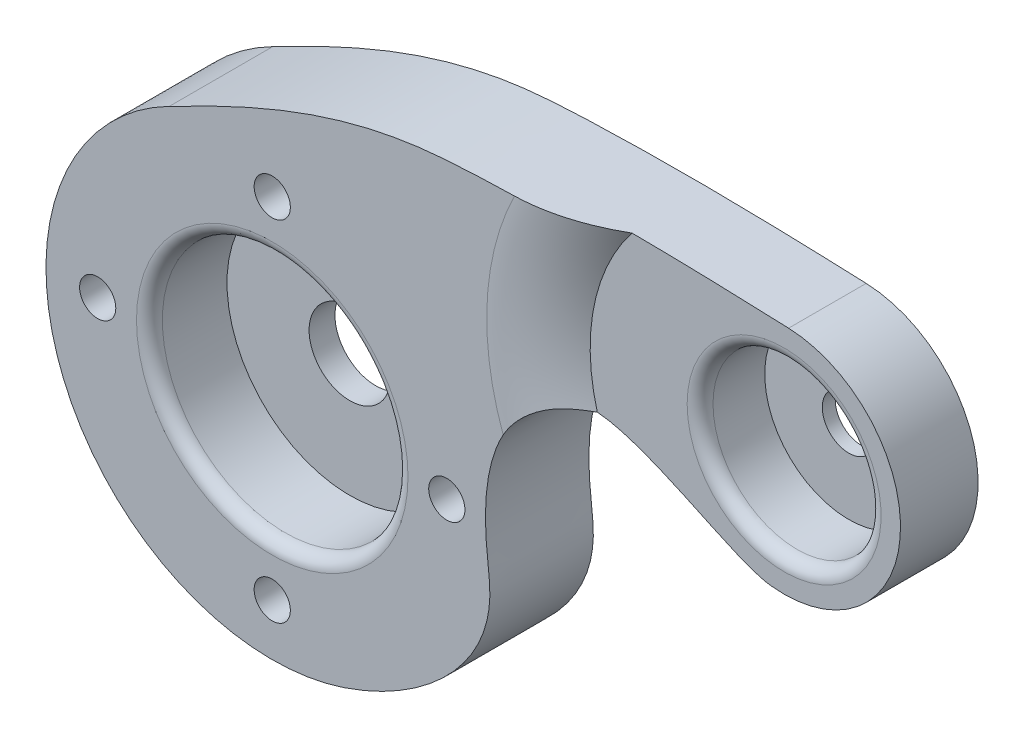
ISO-10303-21;
HEADER;
FILE_DESCRIPTION(('STEP AP214'),'2;1');
FILE_NAME('part.step','',(''),(''),'','','');
FILE_SCHEMA(('AUTOMOTIVE_DESIGN { 1 0 10303 214 1 1 1 1 }'));
ENDSEC;
DATA;
#1=APPLICATION_CONTEXT('core data for automotive mechanical design processes');
#2=APPLICATION_PROTOCOL_DEFINITION('international standard','automotive_design',2000,#1);
#3=PRODUCT_CONTEXT('',#1,'mechanical');
#4=PRODUCT('Part','Part','',(#3));
#5=PRODUCT_RELATED_PRODUCT_CATEGORY('part','',(#4));
#6=PRODUCT_DEFINITION_FORMATION('','',#4);
#7=PRODUCT_DEFINITION_CONTEXT('part definition',#1,'design');
#8=PRODUCT_DEFINITION('design','',#6,#7);
#9=PRODUCT_DEFINITION_SHAPE('','',#8);
#10=(LENGTH_UNIT() NAMED_UNIT(*) SI_UNIT(.MILLI.,.METRE.));
#11=(NAMED_UNIT(*) PLANE_ANGLE_UNIT() SI_UNIT($,.RADIAN.));
#12=(NAMED_UNIT(*) SI_UNIT($,.STERADIAN.) SOLID_ANGLE_UNIT());
#13=UNCERTAINTY_MEASURE_WITH_UNIT(LENGTH_MEASURE(1.E-05),#10,'distance_accuracy_value','');
#14=(GEOMETRIC_REPRESENTATION_CONTEXT(3) GLOBAL_UNCERTAINTY_ASSIGNED_CONTEXT((#13)) GLOBAL_UNIT_ASSIGNED_CONTEXT((#10,
#11,#12)) REPRESENTATION_CONTEXT('',''));
#15=CARTESIAN_POINT('',(0.,0.,0.));
#16=DIRECTION('',(0.,0.,1.));
#17=DIRECTION('',(1.,0.,0.));
#18=AXIS2_PLACEMENT_3D('',#15,#16,#17);
#19=CARTESIAN_POINT('',(37.5877048314363,13.6808057330268,8.));
#20=DIRECTION('',(0.,0.,-1.));
#21=DIRECTION('',(-1.,0.,0.));
#22=AXIS2_PLACEMENT_3D('',#19,#20,#21);
#23=CYLINDRICAL_SURFACE('',#22,2.04999999999999);
#24=CARTESIAN_POINT('',(37.5877048314363,13.6808057330268,0.));
#25=DIRECTION('',(0.,0.,1.));
#26=DIRECTION('',(1.,0.,0.));
#27=AXIS2_PLACEMENT_3D('',#24,#25,#26);
#28=CIRCLE('',#27,2.04999999999999);
#29=CARTESIAN_POINT('',(39.6377048314363,13.6808057330268,0.));
#30=VERTEX_POINT('',#29);
#31=EDGE_CURVE('E161',#30,#30,#28,.T.);
#32=ORIENTED_EDGE('',*,*,#31,.F.);
#33=EDGE_LOOP('',(#32));
#34=FACE_BOUND('',#33,.T.);
#35=CARTESIAN_POINT('',(37.5877048314363,13.6808057330268,1.));
#36=DIRECTION('',(0.,0.,1.));
#37=DIRECTION('',(1.,0.,0.));
#38=AXIS2_PLACEMENT_3D('',#35,#36,#37);
#39=CIRCLE('',#38,2.04999999999999);
#40=CARTESIAN_POINT('',(39.6377048314363,13.6808057330268,1.));
#41=VERTEX_POINT('',#40);
#42=EDGE_CURVE('E304',#41,#41,#39,.T.);
#43=ORIENTED_EDGE('',*,*,#42,.T.);
#44=EDGE_LOOP('',(#43));
#45=FACE_BOUND('',#44,.T.);
#46=ADVANCED_FACE('F35',(#34,#45),#23,.F.);
#47=CARTESIAN_POINT('',(0.,0.,8.));
#48=DIRECTION('',(0.,0.,-1.));
#49=DIRECTION('',(-1.,0.,0.));
#50=AXIS2_PLACEMENT_3D('',#47,#48,#49);
#51=CYLINDRICAL_SURFACE('',#50,3.15);
#52=CARTESIAN_POINT('',(0.,0.,0.));
#53=DIRECTION('',(0.,0.,1.));
#54=DIRECTION('',(1.,0.,0.));
#55=AXIS2_PLACEMENT_3D('',#52,#53,#54);
#56=CIRCLE('',#55,3.15);
#57=CARTESIAN_POINT('',(3.15,0.,0.));
#58=VERTEX_POINT('',#57);
#59=EDGE_CURVE('E228',#58,#58,#56,.T.);
#60=ORIENTED_EDGE('',*,*,#59,.F.);
#61=EDGE_LOOP('',(#60));
#62=FACE_BOUND('',#61,.T.);
#63=CARTESIAN_POINT('',(0.,0.,2.));
#64=DIRECTION('',(0.,0.,1.));
#65=DIRECTION('',(1.,0.,0.));
#66=AXIS2_PLACEMENT_3D('',#63,#64,#65);
#67=CIRCLE('',#66,3.15);
#68=CARTESIAN_POINT('',(3.15,0.,2.));
#69=VERTEX_POINT('',#68);
#70=EDGE_CURVE('E110',#69,#69,#67,.T.);
#71=ORIENTED_EDGE('',*,*,#70,.T.);
#72=EDGE_LOOP('',(#71));
#73=FACE_BOUND('',#72,.T.);
#74=ADVANCED_FACE('F273',(#62,#73),#51,.F.);
#75=CARTESIAN_POINT('',(0.,0.,8.));
#76=DIRECTION('',(0.,0.,-1.));
#77=DIRECTION('',(-1.,0.,0.));
#78=AXIS2_PLACEMENT_3D('',#75,#76,#77);
#79=CYLINDRICAL_SURFACE('',#78,17.5);
#80=CARTESIAN_POINT('',(0.,0.,0.));
#81=DIRECTION('',(0.,0.,1.));
#82=DIRECTION('',(1.,0.,0.));
#83=AXIS2_PLACEMENT_3D('',#80,#81,#82);
#84=CIRCLE('',#83,17.5);
#85=CARTESIAN_POINT('',(-7.96176737995493,15.58397446698,0.));
#86=VERTEX_POINT('',#85);
#87=CARTESIAN_POINT('',(5.55768387836295,-16.5940395898101,0.));
#88=VERTEX_POINT('',#87);
#89=EDGE_CURVE('E204',#86,#88,#84,.T.);
#90=ORIENTED_EDGE('',*,*,#89,.T.);
#91=DIRECTION('',(0.,0.,-1.));
#92=VECTOR('',#91,1.);
#93=CARTESIAN_POINT('',(5.55768387836295,-16.5940395898101,8.));
#94=LINE('',#93,#92);
#95=CARTESIAN_POINT('',(5.55768387836295,-16.5940395898101,8.));
#96=VERTEX_POINT('',#95);
#97=EDGE_CURVE('E186',#96,#88,#94,.T.);
#98=ORIENTED_EDGE('',*,*,#97,.F.);
#99=CARTESIAN_POINT('',(0.,0.,8.));
#100=DIRECTION('',(0.,0.,1.));
#101=DIRECTION('',(1.,0.,0.));
#102=AXIS2_PLACEMENT_3D('',#99,#100,#101);
#103=CIRCLE('',#102,17.5);
#104=CARTESIAN_POINT('',(-7.96176737995493,15.58397446698,8.));
#105=VERTEX_POINT('',#104);
#106=EDGE_CURVE('E157',#105,#96,#103,.T.);
#107=ORIENTED_EDGE('',*,*,#106,.F.);
#108=DIRECTION('',(0.,0.,-1.));
#109=VECTOR('',#108,1.);
#110=CARTESIAN_POINT('',(-7.96176737995493,15.58397446698,8.));
#111=LINE('',#110,#109);
#112=EDGE_CURVE('E235',#105,#86,#111,.T.);
#113=ORIENTED_EDGE('',*,*,#112,.T.);
#114=EDGE_LOOP('',(#90,#98,#107,#113));
#115=FACE_BOUND('',#114,.T.);
#116=ADVANCED_FACE('F245',(#115),#79,.T.);
#117=CARTESIAN_POINT('',(5.55768387836296,-16.5940395898101,8.));
#118=CARTESIAN_POINT('',(11.479074634782,-14.6108444933824,8.));
#119=CARTESIAN_POINT('',(17.7514051432126,-9.23424516396689,8.));
#120=CARTESIAN_POINT('',(16.1157576191301,0.631694435639719,8.));
#121=CARTESIAN_POINT('',(16.8258100093931,7.05228605404796,8.));
#122=CARTESIAN_POINT('',(24.2741784094079,11.5056013909045,8.));
#123=CARTESIAN_POINT('',(33.3007065582728,5.11380794582418,8.));
#124=CARTESIAN_POINT('',(36.5613375805055,4.73952113481514,8.));
#125=B_SPLINE_CURVE_WITH_KNOTS('',3,(#117,#118,#119,#120,#121,#122,#123,#124),.UNSPECIFIED.,.F.,
.F.,(4,1,1,1,1,4),(0.,0.382951964631993,0.45496999005837,0.690712447129833,0.748162228837389,
1.),.UNSPECIFIED.);
#126=DIRECTION('',(0.,0.,-1.));
#127=VECTOR('',#126,1.);
#128=SURFACE_OF_LINEAR_EXTRUSION('',#125,#127);
#129=CARTESIAN_POINT('',(23.1382459260945,9.65425170472237,6.));
#130=CARTESIAN_POINT('',(23.2640152070081,9.64419759604737,6.));
#131=CARTESIAN_POINT('',(23.3894895816123,9.63095530208401,6.));
#132=CARTESIAN_POINT('',(23.6393187707081,9.59895935829436,6.));
#133=CARTESIAN_POINT('',(23.7636759130966,9.58022403562799,6.));
#134=CARTESIAN_POINT('',(24.0113725867275,9.53806394873069,6.));
#135=CARTESIAN_POINT('',(24.1347134347386,9.51464678892156,6.));
#136=CARTESIAN_POINT('',(24.3804743815391,9.46375185238557,6.));
#137=CARTESIAN_POINT('',(24.5028949759453,9.43627645486302,6.));
#138=CARTESIAN_POINT('',(24.7468840804066,9.37779333873347,6.));
#139=CARTESIAN_POINT('',(24.8684525921673,9.34678562719945,6.));
#140=CARTESIAN_POINT('',(25.1104430429565,9.28177303349309,6.));
#141=CARTESIAN_POINT('',(25.2308671418245,9.24777615697567,6.));
#142=CARTESIAN_POINT('',(25.4709865467708,9.17707705632932,6.));
#143=CARTESIAN_POINT('',(25.5906814241183,9.14037338101798,6.));
#144=CARTESIAN_POINT('',(25.8293728435823,9.06458397882042,6.));
#145=CARTESIAN_POINT('',(25.9483690409156,9.02549716912471,6.));
#146=CARTESIAN_POINT('',(26.1856814027588,8.94522775323157,6.));
#147=CARTESIAN_POINT('',(26.3039974051384,8.90404466868637,6.));
#148=CARTESIAN_POINT('',(26.5399560930011,8.81983735309761,6.));
#149=CARTESIAN_POINT('',(26.6575988498692,8.7768133215123,6.));
#150=CARTESIAN_POINT('',(27.0491666860144,8.6305252254352,6.));
#151=CARTESIAN_POINT('',(27.3217384425215,8.52363151589613,6.));
#152=CARTESIAN_POINT('',(27.8640781805346,8.30324580659157,6.));
#153=CARTESIAN_POINT('',(28.1338469773217,8.18975579260304,6.));
#154=CARTESIAN_POINT('',(28.6713122334807,7.95788055544542,6.));
#155=CARTESIAN_POINT('',(28.9390083746226,7.83949459759205,6.));
#156=CARTESIAN_POINT('',(29.4729367217552,7.59930081776597,6.));
#157=CARTESIAN_POINT('',(29.7391685304912,7.4774921171818,6.));
#158=CARTESIAN_POINT('',(30.2707274201056,7.23181073359647,6.));
#159=CARTESIAN_POINT('',(30.5360543445288,7.10793771350316,6.));
#160=CARTESIAN_POINT('',(31.0663604028722,6.85948424497285,6.));
#161=CARTESIAN_POINT('',(31.3313395524361,6.73490382979949,6.));
#162=CARTESIAN_POINT('',(31.8636413985895,6.48554076091835,6.));
#163=CARTESIAN_POINT('',(32.1309667025719,6.36076366336839,6.));
#164=CARTESIAN_POINT('',(32.6667301791345,6.11374498027342,6.));
#165=CARTESIAN_POINT('',(32.9351681079728,5.99150287132084,6.));
#166=CARTESIAN_POINT('',(33.3394377454827,5.81186672828693,6.));
#167=CARTESIAN_POINT('',(33.4744431251265,5.75261761674402,6.));
#168=CARTESIAN_POINT('',(33.7451617893349,5.63577780997365,6.));
#169=CARTESIAN_POINT('',(33.8808750289158,5.57818701084321,6.));
#170=CARTESIAN_POINT('',(34.1531935334519,5.4651801852718,6.));
#171=CARTESIAN_POINT('',(34.2897987204491,5.40976397165864,6.));
#172=CARTESIAN_POINT('',(34.5641723361399,5.30177234603853,6.));
#173=CARTESIAN_POINT('',(34.7019410365612,5.24919762010858,6.));
#174=CARTESIAN_POINT('',(34.9792088653701,5.14772755443842,6.));
#175=CARTESIAN_POINT('',(35.1187113480634,5.09884132904292,6.));
#176=CARTESIAN_POINT('',(35.3993628021552,5.00627397813085,6.));
#177=CARTESIAN_POINT('',(35.5405106113704,4.96258939719899,6.));
#178=CARTESIAN_POINT('',(35.7546722455652,4.90229300506396,6.));
#179=CARTESIAN_POINT('',(35.826919809411,4.88296318830775,6.));
#180=CARTESIAN_POINT('',(35.9719756892752,4.84659111114364,6.));
#181=CARTESIAN_POINT('',(36.0447838793624,4.82954835199096,6.));
#182=CARTESIAN_POINT('',(36.1911746847854,4.79820868878696,6.));
#183=CARTESIAN_POINT('',(36.2647586835575,4.78391810987329,6.));
#184=CARTESIAN_POINT('',(36.4125776331145,4.75887291074931,6.));
#185=CARTESIAN_POINT('',(36.4868130366664,4.74812098972282,6.));
#186=CARTESIAN_POINT('',(36.5613380428642,4.73952108174113,6.));
#187=B_SPLINE_CURVE_WITH_KNOTS('',3,(#129,#130,#131,#132,#133,#134,#135,#136,#137,#138,#139,
#140,#141,#142,#143,#144,#145,#146,#147,#148,#149,#150,#151,#152,#153,#154,#155,#156,#157,#158,
#159,#160,#161,#162,#163,#164,#165,#166,#167,#168,#169,#170,#171,#172,#173,#174,#175,#176,#177,
#178,#179,#180,#181,#182,#183,#184,#185,#186),.UNSPECIFIED.,.F.,.F.,(4,2,2,2,2,2,2,2,2,2,2,2,2,
2,2,2,2,2,2,2,2,2,2,2,2,2,2,2,4),(0.,0.378413101132713,0.755577744736163,1.13213468817418,
1.5084717391717,1.88480803661887,2.26016545467898,2.63572559502935,3.01145766660122,
3.3872758640207,3.76305344584003,4.64126522098083,5.51921397160913,6.39729494850156,
7.27560342416746,8.15405675619288,9.03246911749472,9.91750389077045,10.8023540709862,
11.2446491933296,11.6869165427271,12.1291457411599,12.5714812431124,13.0148762111495,
13.4579749721292,13.6823116085252,13.9065992434526,14.1313963471106,14.356364524098),.UNSPECIFIED.);
#188=CARTESIAN_POINT('',(23.1382459260945,9.65425170472237,6.));
#189=VERTEX_POINT('',#188);
#190=CARTESIAN_POINT('',(36.5613380428642,4.73952108174113,6.));
#191=VERTEX_POINT('',#190);
#192=EDGE_CURVE('E306',#189,#191,#187,.T.);
#193=ORIENTED_EDGE('',*,*,#192,.F.);
#194=CARTESIAN_POINT('',(23.1382459260945,9.65425170472237,6.));
#195=CARTESIAN_POINT('',(23.0518277695852,9.66112789087465,6.06105006803642));
#196=CARTESIAN_POINT('',(22.9645764911161,9.66655623771168,6.12111975200413));
#197=CARTESIAN_POINT('',(22.7882292760397,9.67394943682212,6.23938713922192));
#198=CARTESIAN_POINT('',(22.6991279454182,9.6759020818045,6.297577542531));
#199=CARTESIAN_POINT('',(22.5194064205331,9.67571954302052,6.41181122302604));
#200=CARTESIAN_POINT('',(22.4287845950047,9.67357964816753,6.46785194987898));
#201=CARTESIAN_POINT('',(22.2461518958988,9.66448810907557,6.57767815753795));
#202=CARTESIAN_POINT('',(22.1541385162113,9.65752642311856,6.63145868293434));
#203=CARTESIAN_POINT('',(21.9693356577708,9.63799593586545,6.73639893083966));
#204=CARTESIAN_POINT('',(21.8765471661252,9.62543343732079,6.78756152743279));
#205=CARTESIAN_POINT('',(21.6906287523463,9.593822503808,6.88707911331834));
#206=CARTESIAN_POINT('',(21.5974990850504,9.5747782011716,6.93543586847965));
#207=CARTESIAN_POINT('',(21.4281377014056,9.53402789892378,7.0206656292895));
#208=CARTESIAN_POINT('',(21.3518896430106,9.51342254723845,7.05803613718981));
#209=CARTESIAN_POINT('',(21.1997037955578,9.46765483920724,7.13064347266055));
#210=CARTESIAN_POINT('',(21.1237661341161,9.44249077017725,7.16587949165405));
#211=CARTESIAN_POINT('',(20.9725174946444,9.38763069671921,7.23410643985465));
#212=CARTESIAN_POINT('',(20.89720654471,9.35793449025728,7.2670972688807));
#213=CARTESIAN_POINT('',(20.7477519602328,9.29421305606305,7.33065392053918));
#214=CARTESIAN_POINT('',(20.6736051958707,9.26020310970301,7.36122771327577));
#215=CARTESIAN_POINT('',(20.5264735299064,9.18793141709829,7.42003567326294));
#216=CARTESIAN_POINT('',(20.4534885430494,9.14966998450027,7.44827001283504));
#217=CARTESIAN_POINT('',(20.3089070708839,9.06911089874885,7.50238894900551));
#218=CARTESIAN_POINT('',(20.2373104340314,9.02681368913505,7.52827380320808));
#219=CARTESIAN_POINT('',(20.0608987350977,8.91672314187641,7.58985587867545));
#220=CARTESIAN_POINT('',(19.9570296128396,8.84660635534186,7.62413247805494));
#221=CARTESIAN_POINT('',(19.7531609194658,8.69887566812984,7.68766723402595));
#222=CARTESIAN_POINT('',(19.6531619176324,8.62126067031613,7.71692465446884));
#223=CARTESIAN_POINT('',(19.5060281757324,8.49981414171227,7.75727148059753));
#224=CARTESIAN_POINT('',(19.4573614097138,8.4584018951669,7.77015395634293));
#225=CARTESIAN_POINT('',(19.3610504309875,8.37406731581311,7.79474707737083));
#226=CARTESIAN_POINT('',(19.3134062176249,8.3311449839717,7.80645772340371));
#227=CARTESIAN_POINT('',(19.1721117164821,8.20019474545614,7.83986806494107));
#228=CARTESIAN_POINT('',(19.0800789994343,8.10996659376458,7.85985177011367));
#229=CARTESIAN_POINT('',(18.8801463101896,7.90264246223522,7.89958225715177));
#230=CARTESIAN_POINT('',(18.7734760127686,7.78414582646613,7.91821362981071));
#231=CARTESIAN_POINT('',(18.5679392227952,7.53975633318769,7.94942780117791));
#232=CARTESIAN_POINT('',(18.4690757504599,7.4138606457518,7.96200826846892));
#233=CARTESIAN_POINT('',(18.2804081510816,7.15686662815936,7.98157743103605));
#234=CARTESIAN_POINT('',(18.1905286264207,7.02582725449599,7.98861681654223));
#235=CARTESIAN_POINT('',(18.0189215155599,6.75849370748196,7.99782330862669));
#236=CARTESIAN_POINT('',(17.937187318545,6.62220392206313,7.99999439764007));
#237=CARTESIAN_POINT('',(17.8595125683635,6.48369311537021,8.));
#238=B_SPLINE_CURVE_WITH_KNOTS('',3,(#194,#195,#196,#197,#198,#199,#200,#201,#202,#203,#204,
#205,#206,#207,#208,#209,#210,#211,#212,#213,#214,#215,#216,#217,#218,#219,#220,#221,#222,#223,
#224,#225,#226,#227,#228,#229,#230,#231,#232,#233,#234,#235,#236,#237),.UNSPECIFIED.,.F.,.F.,(4,
2,2,2,2,2,2,2,2,2,2,2,2,2,2,2,2,2,2,2,2,4),(0.,0.318105111557293,0.637325277391707,
0.956913131544213,1.27716855893641,1.59706450002607,1.91675687931783,2.17875338372789,
2.44084852363304,2.70295535064498,2.96415832593201,3.2253420441609,3.48649709079118,
3.87584826137173,4.26525648824459,4.46078755862933,4.65631850380471,5.04729875547948,
5.52836101749181,6.00960848487516,6.48640057364996,6.96280248747614),.UNSPECIFIED.);
#239=CARTESIAN_POINT('',(17.8595125683635,6.48369311537021,8.));
#240=VERTEX_POINT('',#239);
#241=EDGE_CURVE('E58',#189,#240,#238,.T.);
#242=ORIENTED_EDGE('',*,*,#241,.T.);
#243=EDGE_CURVE('E160',#96,#240,#125,.T.);
#244=ORIENTED_EDGE('',*,*,#243,.F.);
#245=ORIENTED_EDGE('',*,*,#97,.T.);
#246=CARTESIAN_POINT('',(5.55768387836296,-16.5940395898101,0.));
#247=CARTESIAN_POINT('',(11.479074634782,-14.6108444933824,0.));
#248=CARTESIAN_POINT('',(17.7514051432126,-9.23424516396689,0.));
#249=CARTESIAN_POINT('',(16.1157576191301,0.631694435639719,0.));
#250=CARTESIAN_POINT('',(16.8258100093931,7.05228605404796,0.));
#251=CARTESIAN_POINT('',(24.2741784094079,11.5056013909045,0.));
#252=CARTESIAN_POINT('',(33.3007065582728,5.11380794582418,0.));
#253=CARTESIAN_POINT('',(36.5613375805055,4.73952113481514,0.));
#254=B_SPLINE_CURVE_WITH_KNOTS('',3,(#246,#247,#248,#249,#250,#251,#252,#253),.UNSPECIFIED.,.F.,
.F.,(4,1,1,1,1,4),(0.,0.382951964631993,0.45496999005837,0.690712447129833,0.748162228837389,
1.),.UNSPECIFIED.);
#255=CARTESIAN_POINT('',(36.5613375805055,4.73952113481514,0.));
#256=VERTEX_POINT('',#255);
#257=EDGE_CURVE('E208',#88,#256,#254,.T.);
#258=ORIENTED_EDGE('',*,*,#257,.T.);
#259=DIRECTION('',(0.,0.,-1.));
#260=VECTOR('',#259,1.);
#261=CARTESIAN_POINT('',(36.5613375805055,4.73952113481514,8.));
#262=LINE('',#261,#260);
#263=EDGE_CURVE('E183',#191,#256,#262,.T.);
#264=ORIENTED_EDGE('',*,*,#263,.F.);
#265=EDGE_LOOP('',(#193,#242,#244,#245,#258,#264));
#266=FACE_BOUND('',#265,.T.);
#267=ADVANCED_FACE('F175',(#266),#128,.F.);
#268=CARTESIAN_POINT('',(37.5877048314363,13.6808057330268,8.));
#269=DIRECTION('',(0.,0.,-1.));
#270=DIRECTION('',(-1.,0.,0.));
#271=AXIS2_PLACEMENT_3D('',#268,#269,#270);
#272=CYLINDRICAL_SURFACE('',#271,9.);
#273=DIRECTION('',(0.,0.,-1.));
#274=VECTOR('',#273,1.);
#275=CARTESIAN_POINT('',(37.9339099182018,22.6741444922362,8.));
#276=LINE('',#275,#274);
#277=CARTESIAN_POINT('',(37.9339099182018,22.6741444922362,6.));
#278=VERTEX_POINT('',#277);
#279=CARTESIAN_POINT('',(37.9339099182018,22.6741444922362,0.));
#280=VERTEX_POINT('',#279);
#281=EDGE_CURVE('E187',#278,#280,#276,.T.);
#282=ORIENTED_EDGE('',*,*,#281,.F.);
#283=CARTESIAN_POINT('',(37.5877048314363,13.6808057330268,6.));
#284=DIRECTION('',(0.,0.,1.));
#285=DIRECTION('',(1.,0.,0.));
#286=AXIS2_PLACEMENT_3D('',#283,#284,#285);
#287=CIRCLE('',#286,9.);
#288=EDGE_CURVE('E104',#191,#278,#287,.T.);
#289=ORIENTED_EDGE('',*,*,#288,.F.);
#290=ORIENTED_EDGE('',*,*,#263,.T.);
#291=CARTESIAN_POINT('',(37.5877048314363,13.6808057330268,0.));
#292=DIRECTION('',(0.,0.,1.));
#293=DIRECTION('',(1.,0.,0.));
#294=AXIS2_PLACEMENT_3D('',#291,#292,#293);
#295=CIRCLE('',#294,9.);
#296=EDGE_CURVE('E213',#256,#280,#295,.T.);
#297=ORIENTED_EDGE('',*,*,#296,.T.);
#298=EDGE_LOOP('',(#282,#289,#290,#297));
#299=FACE_BOUND('',#298,.T.);
#300=ADVANCED_FACE('F240',(#299),#272,.T.);
#301=CARTESIAN_POINT('',(-7.96176737995493,15.58397446698,8.));
#302=CARTESIAN_POINT('',(-3.03976755270781,18.0985972772107,8.));
#303=CARTESIAN_POINT('',(5.12659711971645,22.3177325472778,8.));
#304=CARTESIAN_POINT('',(23.5839226536664,23.2268803185537,8.));
#305=CARTESIAN_POINT('',(32.6527035131636,22.8774483564223,8.));
#306=CARTESIAN_POINT('',(37.9339099182018,22.6741444922362,8.));
#307=B_SPLINE_CURVE_WITH_KNOTS('',3,(#301,#302,#303,#304,#305,#306),.UNSPECIFIED.,.F.,.F.,(4,1,
1,4),(0.,0.42935977411027,0.52935977411027,1.),.UNSPECIFIED.);
#308=DIRECTION('',(0.,0.,-1.));
#309=VECTOR('',#308,1.);
#310=SURFACE_OF_LINEAR_EXTRUSION('',#307,#309);
#311=CARTESIAN_POINT('',(18.7319711627261,22.925334266958,8.));
#312=VERTEX_POINT('',#311);
#313=EDGE_CURVE('E94',#105,#312,#307,.T.);
#314=ORIENTED_EDGE('',*,*,#313,.T.);
#315=CARTESIAN_POINT('',(18.7319711627261,22.925334266958,8.));
#316=CARTESIAN_POINT('',(19.0200956417771,22.9326696939783,8.00001241276105));
#317=CARTESIAN_POINT('',(19.308200920785,22.9393862228274,7.99021082920531));
#318=CARTESIAN_POINT('',(19.882999727678,22.9515987867404,7.95154051134526));
#319=CARTESIAN_POINT('',(20.1696939493268,22.9570954959826,7.92268234460729));
#320=CARTESIAN_POINT('',(20.7405989945753,22.9668934578901,7.84646119740472));
#321=CARTESIAN_POINT('',(21.0248099930522,22.9711947954057,7.79909953093742));
#322=CARTESIAN_POINT('',(21.5831570956644,22.9785618135473,7.68779157652881));
#323=CARTESIAN_POINT('',(21.8573743814852,22.9816537053364,7.62425299134695));
#324=CARTESIAN_POINT('',(22.4014565598246,22.9867952986722,7.48071994631038));
#325=CARTESIAN_POINT('',(22.671321617014,22.9888450397396,7.40072611063816));
#326=CARTESIAN_POINT('',(23.2057476015314,22.9919688380199,7.22493873556429));
#327=CARTESIAN_POINT('',(23.4703105850228,22.9930432809083,7.12915145930374));
#328=CARTESIAN_POINT('',(23.9117767832576,22.9940987093451,6.95466305272126));
#329=CARTESIAN_POINT('',(24.0902721384826,22.9943162853434,6.87995761519248));
#330=CARTESIAN_POINT('',(24.4441269774157,22.9943531463979,6.72358209783176));
#331=CARTESIAN_POINT('',(24.6194873786626,22.994172549981,6.64191409755298));
#332=CARTESIAN_POINT('',(24.9687747520617,22.9934370953051,6.47086555311894));
#333=CARTESIAN_POINT('',(25.142665283088,22.9928781803044,6.38141066532571));
#334=CARTESIAN_POINT('',(25.486852870469,22.9914118636772,6.19573143493917));
#335=CARTESIAN_POINT('',(25.6571489514758,22.9905043687147,6.09950528490828));
#336=CARTESIAN_POINT('',(25.825503891435,22.9894376973417,6.00000000000079));
#337=B_SPLINE_CURVE_WITH_KNOTS('',3,(#315,#316,#317,#318,#319,#320,#321,#322,#323,#324,#325,
#326,#327,#328,#329,#330,#331,#332,#333,#334,#335,#336),.UNSPECIFIED.,.F.,.F.,(4,2,2,2,2,2,2,2,
2,2,4),(0.,0.86443499384934,1.72839102924543,2.5922857232937,3.43625549942053,4.28019326788867,
5.12379716077962,5.70415210343009,6.28433431098302,6.8708385373758,7.45749991624713),.UNSPECIFIED.);
#338=CARTESIAN_POINT('',(25.8255038914347,22.9894376973417,6.));
#339=VERTEX_POINT('',#338);
#340=EDGE_CURVE('E89',#312,#339,#337,.T.);
#341=ORIENTED_EDGE('',*,*,#340,.T.);
#342=CARTESIAN_POINT('',(37.9339099182018,22.6741444922362,6.));
#343=CARTESIAN_POINT('',(37.6817286767441,22.6838560351294,6.));
#344=CARTESIAN_POINT('',(37.4295471509539,22.6935604838647,6.));
#345=CARTESIAN_POINT('',(36.9251793516716,22.7128502666749,6.));
#346=CARTESIAN_POINT('',(36.6729930781759,22.7224356006552,6.));
#347=CARTESIAN_POINT('',(35.9164421602507,22.7508547401806,6.));
#348=CARTESIAN_POINT('',(35.4120647273461,22.7693524973701,6.));
#349=CARTESIAN_POINT('',(34.4032758180736,22.8048590246133,6.));
#350=CARTESIAN_POINT('',(33.8988643436793,22.8218678502254,6.));
#351=CARTESIAN_POINT('',(32.8899928629574,22.8539738760684,6.));
#352=CARTESIAN_POINT('',(32.3855328581792,22.8690711246187,6.));
#353=CARTESIAN_POINT('',(31.3765404978283,22.8970286762485,6.));
#354=CARTESIAN_POINT('',(30.8720081410278,22.9098889353228,6.));
#355=CARTESIAN_POINT('',(29.8628808508515,22.9331110855446,6.));
#356=CARTESIAN_POINT('',(29.3582859169342,22.9434729532995,6.));
#357=CARTESIAN_POINT('',(28.3490295187228,22.9614783542867,6.));
#358=CARTESIAN_POINT('',(27.8443680527264,22.9691217930705,6.));
#359=CARTESIAN_POINT('',(26.8349760073968,22.9815046065696,6.));
#360=CARTESIAN_POINT('',(26.3302454256988,22.9862437875608,6.));
#361=CARTESIAN_POINT('',(25.8255038914347,22.9894376973417,6.));
#362=B_SPLINE_CURVE_WITH_KNOTS('',3,(#342,#343,#344,#345,#346,#347,#348,#349,#350,#351,#352,
#353,#354,#355,#356,#357,#358,#359,#360,#361),.UNSPECIFIED.,.F.,.F.,(4,2,2,2,2,2,2,2,2,4),(0.,
0.75710451227459,1.5142096252473,3.02835773010907,4.54244931156468,6.05650261333472,
7.57058569563838,9.0846829538338,10.5988328123832,12.1130836591152),.UNSPECIFIED.);
#363=EDGE_CURVE('E92',#278,#339,#362,.T.);
#364=ORIENTED_EDGE('',*,*,#363,.F.);
#365=ORIENTED_EDGE('',*,*,#281,.T.);
#366=CARTESIAN_POINT('',(-7.96176737995493,15.58397446698,0.));
#367=CARTESIAN_POINT('',(-3.03976755270781,18.0985972772107,0.));
#368=CARTESIAN_POINT('',(5.12659711971645,22.3177325472778,0.));
#369=CARTESIAN_POINT('',(23.5839226536664,23.2268803185537,0.));
#370=CARTESIAN_POINT('',(32.6527035131636,22.8774483564223,0.));
#371=CARTESIAN_POINT('',(37.9339099182018,22.6741444922362,0.));
#372=B_SPLINE_CURVE_WITH_KNOTS('',3,(#366,#367,#368,#369,#370,#371),.UNSPECIFIED.,.F.,.F.,(4,1,
1,4),(0.,0.42935977411027,0.52935977411027,1.),.UNSPECIFIED.);
#373=EDGE_CURVE('E223',#86,#280,#372,.T.);
#374=ORIENTED_EDGE('',*,*,#373,.F.);
#375=ORIENTED_EDGE('',*,*,#112,.F.);
#376=EDGE_LOOP('',(#314,#341,#364,#365,#374,#375));
#377=FACE_BOUND('',#376,.T.);
#378=ADVANCED_FACE('F91',(#377),#310,.T.);
#379=CARTESIAN_POINT('',(0.,0.,8.));
#380=DIRECTION('',(0.,0.,1.));
#381=DIRECTION('',(1.,0.,0.));
#382=AXIS2_PLACEMENT_3D('',#379,#380,#381);
#383=PLANE('',#382);
#384=CARTESIAN_POINT('',(0.,0.,8.));
#385=DIRECTION('',(0.,0.,1.));
#386=DIRECTION('',(1.,0.,0.));
#387=AXIS2_PLACEMENT_3D('',#384,#385,#386);
#388=CIRCLE('',#387,10.5);
#389=CARTESIAN_POINT('',(10.5,0.,8.));
#390=VERTEX_POINT('',#389);
#391=EDGE_CURVE('E11',#390,#390,#388,.F.);
#392=ORIENTED_EDGE('',*,*,#391,.T.);
#393=EDGE_LOOP('',(#392));
#394=FACE_BOUND('',#393,.T.);
#395=ORIENTED_EDGE('',*,*,#243,.T.);
#396=CARTESIAN_POINT('',(37.5877048314363,13.6808057330268,8.));
#397=DIRECTION('',(0.,0.,1.));
#398=DIRECTION('',(1.,0.,0.));
#399=AXIS2_PLACEMENT_3D('',#396,#397,#398);
#400=CIRCLE('',#399,21.);
#401=EDGE_CURVE('E50',#240,#312,#400,.F.);
#402=ORIENTED_EDGE('',*,*,#401,.T.);
#403=ORIENTED_EDGE('',*,*,#313,.F.);
#404=ORIENTED_EDGE('',*,*,#106,.T.);
#405=EDGE_LOOP('',(#395,#402,#403,#404));
#406=FACE_BOUND('',#405,.T.);
#407=CARTESIAN_POINT('',(0.,13.5,8.));
#408=DIRECTION('',(0.,0.,1.));
#409=DIRECTION('',(1.,0.,0.));
#410=AXIS2_PLACEMENT_3D('',#407,#408,#409);
#411=CIRCLE('',#410,1.4);
#412=CARTESIAN_POINT('',(1.4,13.5,8.));
#413=VERTEX_POINT('',#412);
#414=EDGE_CURVE('E144',#413,#413,#411,.T.);
#415=ORIENTED_EDGE('',*,*,#414,.F.);
#416=EDGE_LOOP('',(#415));
#417=FACE_BOUND('',#416,.T.);
#418=CARTESIAN_POINT('',(13.5,0.,8.));
#419=DIRECTION('',(0.,0.,1.));
#420=DIRECTION('',(1.,0.,0.));
#421=AXIS2_PLACEMENT_3D('',#418,#419,#420);
#422=CIRCLE('',#421,1.4);
#423=CARTESIAN_POINT('',(14.9,0.,8.));
#424=VERTEX_POINT('',#423);
#425=EDGE_CURVE('E148',#424,#424,#422,.T.);
#426=ORIENTED_EDGE('',*,*,#425,.F.);
#427=EDGE_LOOP('',(#426));
#428=FACE_BOUND('',#427,.T.);
#429=CARTESIAN_POINT('',(0.,-13.5,8.));
#430=DIRECTION('',(0.,0.,1.));
#431=DIRECTION('',(1.,0.,0.));
#432=AXIS2_PLACEMENT_3D('',#429,#430,#431);
#433=CIRCLE('',#432,1.4);
#434=CARTESIAN_POINT('',(1.4,-13.5,8.));
#435=VERTEX_POINT('',#434);
#436=EDGE_CURVE('E151',#435,#435,#433,.T.);
#437=ORIENTED_EDGE('',*,*,#436,.F.);
#438=EDGE_LOOP('',(#437));
#439=FACE_BOUND('',#438,.T.);
#440=CARTESIAN_POINT('',(-13.5,0.,8.));
#441=DIRECTION('',(0.,0.,1.));
#442=DIRECTION('',(1.,0.,0.));
#443=AXIS2_PLACEMENT_3D('',#440,#441,#442);
#444=CIRCLE('',#443,1.4);
#445=CARTESIAN_POINT('',(-12.1,0.,8.));
#446=VERTEX_POINT('',#445);
#447=EDGE_CURVE('E154',#446,#446,#444,.T.);
#448=ORIENTED_EDGE('',*,*,#447,.F.);
#449=EDGE_LOOP('',(#448));
#450=FACE_BOUND('',#449,.T.);
#451=ADVANCED_FACE('F246',(#394,#406,#417,#428,#439,#450),#383,.T.);
#452=CARTESIAN_POINT('',(0.,0.,0.));
#453=DIRECTION('',(0.,0.,1.));
#454=DIRECTION('',(1.,0.,0.));
#455=AXIS2_PLACEMENT_3D('',#452,#453,#454);
#456=PLANE('',#455);
#457=CARTESIAN_POINT('',(0.,13.5,0.));
#458=DIRECTION('',(0.,0.,1.));
#459=DIRECTION('',(1.,0.,0.));
#460=AXIS2_PLACEMENT_3D('',#457,#458,#459);
#461=CIRCLE('',#460,1.4);
#462=CARTESIAN_POINT('',(1.4,13.5,0.));
#463=VERTEX_POINT('',#462);
#464=EDGE_CURVE('E202',#463,#463,#461,.T.);
#465=ORIENTED_EDGE('',*,*,#464,.T.);
#466=EDGE_LOOP('',(#465));
#467=FACE_BOUND('',#466,.T.);
#468=CARTESIAN_POINT('',(13.5,0.,0.));
#469=DIRECTION('',(0.,0.,1.));
#470=DIRECTION('',(1.,0.,0.));
#471=AXIS2_PLACEMENT_3D('',#468,#469,#470);
#472=CIRCLE('',#471,1.4);
#473=CARTESIAN_POINT('',(14.9,0.,0.));
#474=VERTEX_POINT('',#473);
#475=EDGE_CURVE('E200',#474,#474,#472,.T.);
#476=ORIENTED_EDGE('',*,*,#475,.T.);
#477=EDGE_LOOP('',(#476));
#478=FACE_BOUND('',#477,.T.);
#479=CARTESIAN_POINT('',(0.,-13.5,0.));
#480=DIRECTION('',(0.,0.,1.));
#481=DIRECTION('',(1.,0.,0.));
#482=AXIS2_PLACEMENT_3D('',#479,#480,#481);
#483=CIRCLE('',#482,1.4);
#484=CARTESIAN_POINT('',(1.4,-13.5,0.));
#485=VERTEX_POINT('',#484);
#486=EDGE_CURVE('E197',#485,#485,#483,.T.);
#487=ORIENTED_EDGE('',*,*,#486,.T.);
#488=EDGE_LOOP('',(#487));
#489=FACE_BOUND('',#488,.T.);
#490=CARTESIAN_POINT('',(-13.5,0.,0.));
#491=DIRECTION('',(0.,0.,1.));
#492=DIRECTION('',(1.,0.,0.));
#493=AXIS2_PLACEMENT_3D('',#490,#491,#492);
#494=CIRCLE('',#493,1.4);
#495=CARTESIAN_POINT('',(-12.1,0.,0.));
#496=VERTEX_POINT('',#495);
#497=EDGE_CURVE('E147',#496,#496,#494,.T.);
#498=ORIENTED_EDGE('',*,*,#497,.T.);
#499=EDGE_LOOP('',(#498));
#500=FACE_BOUND('',#499,.T.);
#501=ORIENTED_EDGE('',*,*,#89,.F.);
#502=ORIENTED_EDGE('',*,*,#373,.T.);
#503=ORIENTED_EDGE('',*,*,#296,.F.);
#504=ORIENTED_EDGE('',*,*,#257,.F.);
#505=EDGE_LOOP('',(#501,#502,#503,#504));
#506=FACE_BOUND('',#505,.T.);
#507=ORIENTED_EDGE('',*,*,#59,.T.);
#508=EDGE_LOOP('',(#507));
#509=FACE_BOUND('',#508,.T.);
#510=ORIENTED_EDGE('',*,*,#31,.T.);
#511=EDGE_LOOP('',(#510));
#512=FACE_BOUND('',#511,.T.);
#513=ADVANCED_FACE('F243',(#467,#478,#489,#500,#506,#509,#512),#456,.F.);
#514=CARTESIAN_POINT('',(-13.5,0.,-2.));
#515=DIRECTION('',(0.,0.,1.));
#516=DIRECTION('',(1.,0.,0.));
#517=AXIS2_PLACEMENT_3D('',#514,#515,#516);
#518=CYLINDRICAL_SURFACE('',#517,1.4);
#519=ORIENTED_EDGE('',*,*,#447,.T.);
#520=EDGE_LOOP('',(#519));
#521=FACE_BOUND('',#520,.T.);
#522=ORIENTED_EDGE('',*,*,#497,.F.);
#523=EDGE_LOOP('',(#522));
#524=FACE_BOUND('',#523,.T.);
#525=ADVANCED_FACE('F259',(#521,#524),#518,.F.);
#526=CARTESIAN_POINT('',(0.,-13.5,-2.));
#527=DIRECTION('',(0.,0.,1.));
#528=DIRECTION('',(1.,0.,0.));
#529=AXIS2_PLACEMENT_3D('',#526,#527,#528);
#530=CYLINDRICAL_SURFACE('',#529,1.4);
#531=ORIENTED_EDGE('',*,*,#436,.T.);
#532=EDGE_LOOP('',(#531));
#533=FACE_BOUND('',#532,.T.);
#534=ORIENTED_EDGE('',*,*,#486,.F.);
#535=EDGE_LOOP('',(#534));
#536=FACE_BOUND('',#535,.T.);
#537=ADVANCED_FACE('F262',(#533,#536),#530,.F.);
#538=CARTESIAN_POINT('',(13.5,0.,-2.));
#539=DIRECTION('',(0.,0.,1.));
#540=DIRECTION('',(1.,0.,0.));
#541=AXIS2_PLACEMENT_3D('',#538,#539,#540);
#542=CYLINDRICAL_SURFACE('',#541,1.4);
#543=ORIENTED_EDGE('',*,*,#425,.T.);
#544=EDGE_LOOP('',(#543));
#545=FACE_BOUND('',#544,.T.);
#546=ORIENTED_EDGE('',*,*,#475,.F.);
#547=EDGE_LOOP('',(#546));
#548=FACE_BOUND('',#547,.T.);
#549=ADVANCED_FACE('F444',(#545,#548),#542,.F.);
#550=CARTESIAN_POINT('',(0.,13.5,-2.));
#551=DIRECTION('',(0.,0.,1.));
#552=DIRECTION('',(1.,0.,0.));
#553=AXIS2_PLACEMENT_3D('',#550,#551,#552);
#554=CYLINDRICAL_SURFACE('',#553,1.4);
#555=ORIENTED_EDGE('',*,*,#414,.T.);
#556=EDGE_LOOP('',(#555));
#557=FACE_BOUND('',#556,.T.);
#558=ORIENTED_EDGE('',*,*,#464,.F.);
#559=EDGE_LOOP('',(#558));
#560=FACE_BOUND('',#559,.T.);
#561=ADVANCED_FACE('F398',(#557,#560),#554,.F.);
#562=CARTESIAN_POINT('',(0.,0.,2.));
#563=DIRECTION('',(0.,0.,1.));
#564=DIRECTION('',(1.,0.,0.));
#565=AXIS2_PLACEMENT_3D('',#562,#563,#564);
#566=CYLINDRICAL_SURFACE('',#565,9.5);
#567=CARTESIAN_POINT('',(0.,0.,7.));
#568=DIRECTION('',(0.,0.,1.));
#569=DIRECTION('',(1.,0.,0.));
#570=AXIS2_PLACEMENT_3D('',#567,#568,#569);
#571=CIRCLE('',#570,9.5);
#572=CARTESIAN_POINT('',(9.5,0.,7.));
#573=VERTEX_POINT('',#572);
#574=EDGE_CURVE('E43',#573,#573,#571,.T.);
#575=ORIENTED_EDGE('',*,*,#574,.T.);
#576=EDGE_LOOP('',(#575));
#577=FACE_BOUND('',#576,.T.);
#578=CARTESIAN_POINT('',(0.,0.,2.));
#579=DIRECTION('',(0.,0.,1.));
#580=DIRECTION('',(1.,0.,0.));
#581=AXIS2_PLACEMENT_3D('',#578,#579,#580);
#582=CIRCLE('',#581,9.5);
#583=CARTESIAN_POINT('',(9.5,0.,2.));
#584=VERTEX_POINT('',#583);
#585=EDGE_CURVE('E107',#584,#584,#582,.T.);
#586=ORIENTED_EDGE('',*,*,#585,.F.);
#587=EDGE_LOOP('',(#586));
#588=FACE_BOUND('',#587,.T.);
#589=ADVANCED_FACE('F338',(#577,#588),#566,.F.);
#590=CARTESIAN_POINT('',(0.,0.,2.));
#591=DIRECTION('',(0.,0.,1.));
#592=DIRECTION('',(1.,0.,0.));
#593=AXIS2_PLACEMENT_3D('',#590,#591,#592);
#594=PLANE('',#593);
#595=ORIENTED_EDGE('',*,*,#70,.F.);
#596=EDGE_LOOP('',(#595));
#597=FACE_BOUND('',#596,.T.);
#598=ORIENTED_EDGE('',*,*,#585,.T.);
#599=EDGE_LOOP('',(#598));
#600=FACE_BOUND('',#599,.T.);
#601=ADVANCED_FACE('F134',(#597,#600),#594,.T.);
#602=CARTESIAN_POINT('',(16.4878524877449,0.431052364357905,6.));
#603=DIRECTION('',(0.,0.,-1.));
#604=DIRECTION('',(-1.,0.,0.));
#605=AXIS2_PLACEMENT_3D('',#602,#603,#604);
#606=PLANE('',#605);
#607=CARTESIAN_POINT('',(37.5877048314363,13.6808057330268,6.));
#608=DIRECTION('',(0.,0.,-1.));
#609=DIRECTION('',(-1.,0.,0.));
#610=AXIS2_PLACEMENT_3D('',#607,#608,#609);
#611=CIRCLE('',#610,7.5);
#612=CARTESIAN_POINT('',(30.0877048314363,13.6808057330268,6.));
#613=VERTEX_POINT('',#612);
#614=EDGE_CURVE('E332',#613,#613,#611,.T.);
#615=ORIENTED_EDGE('',*,*,#614,.T.);
#616=EDGE_LOOP('',(#615));
#617=FACE_BOUND('',#616,.T.);
#618=ORIENTED_EDGE('',*,*,#192,.T.);
#619=ORIENTED_EDGE('',*,*,#288,.T.);
#620=ORIENTED_EDGE('',*,*,#363,.T.);
#621=CARTESIAN_POINT('',(37.5877048314363,13.6808057330268,6.));
#622=DIRECTION('',(0.,0.,1.));
#623=DIRECTION('',(1.,0.,0.));
#624=AXIS2_PLACEMENT_3D('',#621,#622,#623);
#625=CIRCLE('',#624,15.);
#626=EDGE_CURVE('E102',#339,#189,#625,.T.);
#627=ORIENTED_EDGE('',*,*,#626,.T.);
#628=EDGE_LOOP('',(#618,#619,#620,#627));
#629=FACE_BOUND('',#628,.T.);
#630=ADVANCED_FACE('F101',(#617,#629),#606,.F.);
#631=CARTESIAN_POINT('',(37.5877048314363,13.6808057330268,1.));
#632=DIRECTION('',(0.,0.,1.));
#633=DIRECTION('',(1.,0.,0.));
#634=AXIS2_PLACEMENT_3D('',#631,#632,#633);
#635=CYLINDRICAL_SURFACE('',#634,6.5);
#636=CARTESIAN_POINT('',(37.5877048314363,13.6808057330268,5.));
#637=DIRECTION('',(0.,0.,-1.));
#638=DIRECTION('',(-1.,0.,0.));
#639=AXIS2_PLACEMENT_3D('',#636,#637,#638);
#640=CIRCLE('',#639,6.5);
#641=CARTESIAN_POINT('',(31.0877048314363,13.6808057330268,5.));
#642=VERTEX_POINT('',#641);
#643=EDGE_CURVE('E97',#642,#642,#640,.F.);
#644=ORIENTED_EDGE('',*,*,#643,.T.);
#645=EDGE_LOOP('',(#644));
#646=FACE_BOUND('',#645,.T.);
#647=CARTESIAN_POINT('',(37.5877048314363,13.6808057330268,1.));
#648=DIRECTION('',(0.,0.,1.));
#649=DIRECTION('',(1.,0.,0.));
#650=AXIS2_PLACEMENT_3D('',#647,#648,#649);
#651=CIRCLE('',#650,6.5);
#652=CARTESIAN_POINT('',(44.0877048314363,13.6808057330268,1.));
#653=VERTEX_POINT('',#652);
#654=EDGE_CURVE('E114',#653,#653,#651,.T.);
#655=ORIENTED_EDGE('',*,*,#654,.F.);
#656=EDGE_LOOP('',(#655));
#657=FACE_BOUND('',#656,.T.);
#658=ADVANCED_FACE('F319',(#646,#657),#635,.F.);
#659=CARTESIAN_POINT('',(37.5877048314363,13.6808057330268,1.));
#660=DIRECTION('',(0.,0.,1.));
#661=DIRECTION('',(1.,0.,0.));
#662=AXIS2_PLACEMENT_3D('',#659,#660,#661);
#663=PLANE('',#662);
#664=ORIENTED_EDGE('',*,*,#42,.F.);
#665=EDGE_LOOP('',(#664));
#666=FACE_BOUND('',#665,.T.);
#667=ORIENTED_EDGE('',*,*,#654,.T.);
#668=EDGE_LOOP('',(#667));
#669=FACE_BOUND('',#668,.T.);
#670=ADVANCED_FACE('F297',(#666,#669),#663,.T.);
#671=CARTESIAN_POINT('',(37.5877048314363,13.6808057330268,-2.));
#672=DIRECTION('',(0.,0.,1.));
#673=DIRECTION('',(1.,0.,0.));
#674=AXIS2_PLACEMENT_3D('',#671,#672,#673);
#675=TOROIDAL_SURFACE('',#674,21.,10.);
#676=ORIENTED_EDGE('',*,*,#340,.F.);
#677=ORIENTED_EDGE('',*,*,#401,.F.);
#678=ORIENTED_EDGE('',*,*,#241,.F.);
#679=ORIENTED_EDGE('',*,*,#626,.F.);
#680=EDGE_LOOP('',(#676,#677,#678,#679));
#681=FACE_BOUND('',#680,.T.);
#682=ADVANCED_FACE('F106',(#681),#675,.T.);
#683=CARTESIAN_POINT('',(37.5877048314363,13.6808057330268,5.));
#684=DIRECTION('',(0.,0.,-1.));
#685=DIRECTION('',(-1.,0.,0.));
#686=AXIS2_PLACEMENT_3D('',#683,#684,#685);
#687=TOROIDAL_SURFACE('',#686,7.5,1.);
#688=ORIENTED_EDGE('',*,*,#614,.F.);
#689=EDGE_LOOP('',(#688));
#690=FACE_BOUND('',#689,.T.);
#691=ORIENTED_EDGE('',*,*,#643,.F.);
#692=EDGE_LOOP('',(#691));
#693=FACE_BOUND('',#692,.T.);
#694=ADVANCED_FACE('F296',(#690,#693),#687,.T.);
#695=CARTESIAN_POINT('',(0.,0.,7.));
#696=DIRECTION('',(0.,0.,1.));
#697=DIRECTION('',(1.,0.,0.));
#698=AXIS2_PLACEMENT_3D('',#695,#696,#697);
#699=TOROIDAL_SURFACE('',#698,10.5,1.);
#700=ORIENTED_EDGE('',*,*,#391,.F.);
#701=EDGE_LOOP('',(#700));
#702=FACE_BOUND('',#701,.T.);
#703=ORIENTED_EDGE('',*,*,#574,.F.);
#704=EDGE_LOOP('',(#703));
#705=FACE_BOUND('',#704,.T.);
#706=ADVANCED_FACE('F37',(#702,#705),#699,.T.);
#707=CLOSED_SHELL('',(#46,#74,#116,#267,#300,#378,#451,#513,#525,#537,#549,#561,#589,#601,#630,
#658,#670,#682,#694,#706));
#708=MANIFOLD_SOLID_BREP('B2',#707);
#709=ADVANCED_BREP_SHAPE_REPRESENTATION('',(#18,#708),#14);
#710=SHAPE_DEFINITION_REPRESENTATION(#9,#709);
ENDSEC;
END-ISO-10303-21;
